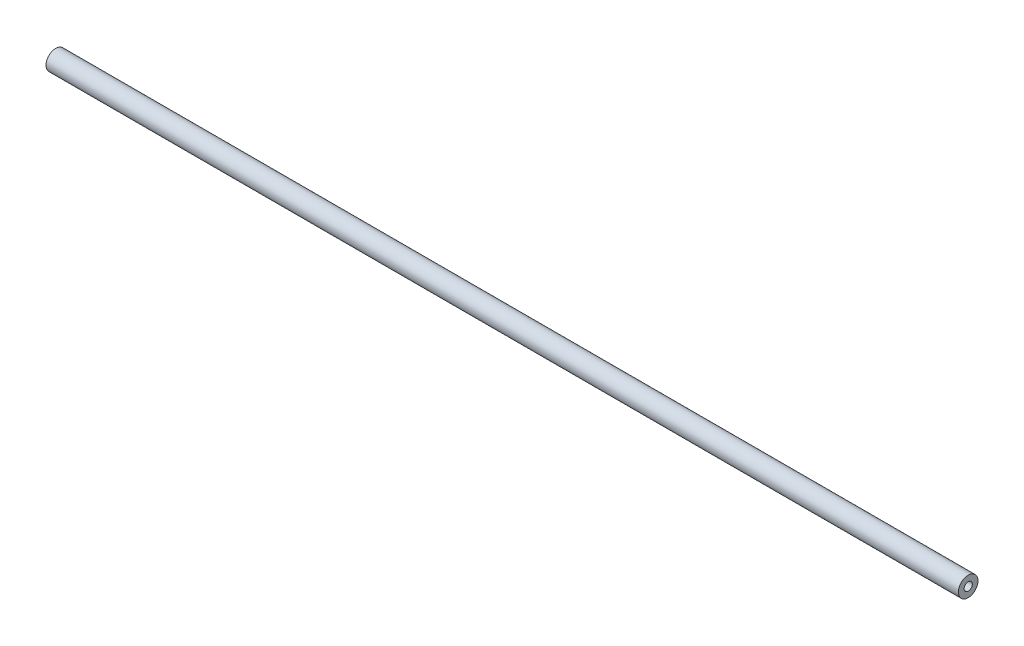
ISO-10303-21;
HEADER;
FILE_DESCRIPTION(('STEP AP214'),'2;1');
FILE_NAME('part.step','',(''),(''),'','','');
FILE_SCHEMA(('AUTOMOTIVE_DESIGN { 1 0 10303 214 1 1 1 1 }'));
ENDSEC;
DATA;
#1=APPLICATION_CONTEXT('core data for automotive mechanical design processes');
#2=APPLICATION_PROTOCOL_DEFINITION('international standard','automotive_design',2000,#1);
#3=PRODUCT_CONTEXT('',#1,'mechanical');
#4=PRODUCT('Part','Part','',(#3));
#5=PRODUCT_RELATED_PRODUCT_CATEGORY('part','',(#4));
#6=PRODUCT_DEFINITION_FORMATION('','',#4);
#7=PRODUCT_DEFINITION_CONTEXT('part definition',#1,'design');
#8=PRODUCT_DEFINITION('design','',#6,#7);
#9=PRODUCT_DEFINITION_SHAPE('','',#8);
#10=(LENGTH_UNIT() NAMED_UNIT(*) SI_UNIT(.MILLI.,.METRE.));
#11=(NAMED_UNIT(*) PLANE_ANGLE_UNIT() SI_UNIT($,.RADIAN.));
#12=(NAMED_UNIT(*) SI_UNIT($,.STERADIAN.) SOLID_ANGLE_UNIT());
#13=UNCERTAINTY_MEASURE_WITH_UNIT(LENGTH_MEASURE(1.E-05),#10,'distance_accuracy_value','');
#14=(GEOMETRIC_REPRESENTATION_CONTEXT(3) GLOBAL_UNCERTAINTY_ASSIGNED_CONTEXT((#13)) GLOBAL_UNIT_ASSIGNED_CONTEXT((#10,
#11,#12)) REPRESENTATION_CONTEXT('',''));
#15=CARTESIAN_POINT('',(0.,0.,0.));
#16=DIRECTION('',(0.,0.,1.));
#17=DIRECTION('',(1.,0.,0.));
#18=AXIS2_PLACEMENT_3D('',#15,#16,#17);
#19=CARTESIAN_POINT('',(222.25,0.,0.));
#20=DIRECTION('',(1.,0.,0.));
#21=DIRECTION('',(0.,0.,-1.));
#22=AXIS2_PLACEMENT_3D('',#19,#20,#21);
#23=PLANE('',#22);
#24=CARTESIAN_POINT('',(222.25,0.,0.));
#25=DIRECTION('',(1.,0.,0.));
#26=DIRECTION('',(0.,0.,-1.));
#27=AXIS2_PLACEMENT_3D('',#24,#25,#26);
#28=CIRCLE('',#27,4.7625);
#29=CARTESIAN_POINT('',(222.25,0.,-4.7625));
#30=VERTEX_POINT('',#29);
#31=EDGE_CURVE('E10',#30,#30,#28,.T.);
#32=ORIENTED_EDGE('',*,*,#31,.T.);
#33=EDGE_LOOP('',(#32));
#34=FACE_BOUND('',#33,.T.);
#35=CARTESIAN_POINT('',(222.25,0.,0.));
#36=DIRECTION('',(1.,0.,0.));
#37=DIRECTION('',(0.,0.,-1.));
#38=AXIS2_PLACEMENT_3D('',#35,#36,#37);
#39=CIRCLE('',#38,1.9939);
#40=CARTESIAN_POINT('',(222.25,0.,-1.9939));
#41=VERTEX_POINT('',#40);
#42=EDGE_CURVE('E44',#41,#41,#39,.T.);
#43=ORIENTED_EDGE('',*,*,#42,.F.);
#44=EDGE_LOOP('',(#43));
#45=FACE_BOUND('',#44,.T.);
#46=ADVANCED_FACE('F33',(#34,#45),#23,.T.);
#47=CARTESIAN_POINT('',(-222.25,0.,0.));
#48=DIRECTION('',(1.,0.,0.));
#49=DIRECTION('',(0.,0.,-1.));
#50=AXIS2_PLACEMENT_3D('',#47,#48,#49);
#51=PLANE('',#50);
#52=CARTESIAN_POINT('',(-222.25,0.,0.));
#53=DIRECTION('',(1.,0.,0.));
#54=DIRECTION('',(0.,0.,-1.));
#55=AXIS2_PLACEMENT_3D('',#52,#53,#54);
#56=CIRCLE('',#55,4.7625);
#57=CARTESIAN_POINT('',(-222.25,0.,-4.7625));
#58=VERTEX_POINT('',#57);
#59=EDGE_CURVE('E37',#58,#58,#56,.T.);
#60=ORIENTED_EDGE('',*,*,#59,.F.);
#61=EDGE_LOOP('',(#60));
#62=FACE_BOUND('',#61,.T.);
#63=CARTESIAN_POINT('',(-222.25,0.,0.));
#64=DIRECTION('',(1.,0.,0.));
#65=DIRECTION('',(0.,0.,-1.));
#66=AXIS2_PLACEMENT_3D('',#63,#64,#65);
#67=CIRCLE('',#66,1.9939);
#68=CARTESIAN_POINT('',(-222.25,0.,-1.9939));
#69=VERTEX_POINT('',#68);
#70=EDGE_CURVE('E46',#69,#69,#67,.T.);
#71=ORIENTED_EDGE('',*,*,#70,.T.);
#72=EDGE_LOOP('',(#71));
#73=FACE_BOUND('',#72,.T.);
#74=ADVANCED_FACE('F56',(#62,#73),#51,.F.);
#75=CARTESIAN_POINT('',(222.25,0.,0.));
#76=DIRECTION('',(-1.,0.,0.));
#77=DIRECTION('',(0.,0.,1.));
#78=AXIS2_PLACEMENT_3D('',#75,#76,#77);
#79=CYLINDRICAL_SURFACE('',#78,4.7625);
#80=ORIENTED_EDGE('',*,*,#31,.F.);
#81=EDGE_LOOP('',(#80));
#82=FACE_BOUND('',#81,.T.);
#83=ORIENTED_EDGE('',*,*,#59,.T.);
#84=EDGE_LOOP('',(#83));
#85=FACE_BOUND('',#84,.T.);
#86=ADVANCED_FACE('F35',(#82,#85),#79,.T.);
#87=CARTESIAN_POINT('',(222.25,0.,0.));
#88=DIRECTION('',(-1.,0.,0.));
#89=DIRECTION('',(0.,0.,1.));
#90=AXIS2_PLACEMENT_3D('',#87,#88,#89);
#91=CYLINDRICAL_SURFACE('',#90,1.9939);
#92=ORIENTED_EDGE('',*,*,#42,.T.);
#93=EDGE_LOOP('',(#92));
#94=FACE_BOUND('',#93,.T.);
#95=ORIENTED_EDGE('',*,*,#70,.F.);
#96=EDGE_LOOP('',(#95));
#97=FACE_BOUND('',#96,.T.);
#98=ADVANCED_FACE('F52',(#94,#97),#91,.F.);
#99=CLOSED_SHELL('',(#46,#74,#86,#98));
#100=MANIFOLD_SOLID_BREP('B2',#99);
#101=ADVANCED_BREP_SHAPE_REPRESENTATION('',(#18,#100),#14);
#102=SHAPE_DEFINITION_REPRESENTATION(#9,#101);
ENDSEC;
END-ISO-10303-21;
